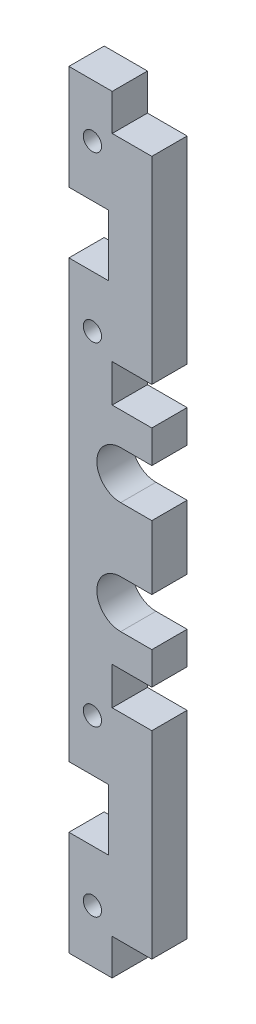
ISO-10303-21;
HEADER;
FILE_DESCRIPTION(('STEP AP214'),'2;1');
FILE_NAME('part.step','',(''),(''),'','','');
FILE_SCHEMA(('AUTOMOTIVE_DESIGN { 1 0 10303 214 1 1 1 1 }'));
ENDSEC;
DATA;
#1=APPLICATION_CONTEXT('core data for automotive mechanical design processes');
#2=APPLICATION_PROTOCOL_DEFINITION('international standard','automotive_design',2000,#1);
#3=PRODUCT_CONTEXT('',#1,'mechanical');
#4=PRODUCT('Part','Part','',(#3));
#5=PRODUCT_RELATED_PRODUCT_CATEGORY('part','',(#4));
#6=PRODUCT_DEFINITION_FORMATION('','',#4);
#7=PRODUCT_DEFINITION_CONTEXT('part definition',#1,'design');
#8=PRODUCT_DEFINITION('design','',#6,#7);
#9=PRODUCT_DEFINITION_SHAPE('','',#8);
#10=(LENGTH_UNIT() NAMED_UNIT(*) SI_UNIT(.MILLI.,.METRE.));
#11=(NAMED_UNIT(*) PLANE_ANGLE_UNIT() SI_UNIT($,.RADIAN.));
#12=(NAMED_UNIT(*) SI_UNIT($,.STERADIAN.) SOLID_ANGLE_UNIT());
#13=UNCERTAINTY_MEASURE_WITH_UNIT(LENGTH_MEASURE(1.E-05),#10,'distance_accuracy_value','');
#14=(GEOMETRIC_REPRESENTATION_CONTEXT(3) GLOBAL_UNCERTAINTY_ASSIGNED_CONTEXT((#13)) GLOBAL_UNIT_ASSIGNED_CONTEXT((#10,
#11,#12)) REPRESENTATION_CONTEXT('',''));
#15=CARTESIAN_POINT('',(0.,0.,0.));
#16=DIRECTION('',(0.,0.,1.));
#17=DIRECTION('',(1.,0.,0.));
#18=AXIS2_PLACEMENT_3D('',#15,#16,#17);
#19=CARTESIAN_POINT('',(-65.3504501830032,-66.5799999991971,-6.));
#20=DIRECTION('',(1.,0.,0.));
#21=DIRECTION('',(0.,0.,-1.));
#22=AXIS2_PLACEMENT_3D('',#19,#20,#21);
#23=PLANE('',#22);
#24=DIRECTION('',(0.,0.,-1.));
#25=VECTOR('',#24,1.);
#26=CARTESIAN_POINT('',(-65.3504501830032,10.1548441508045,4.));
#27=LINE('',#26,#25);
#28=CARTESIAN_POINT('',(-65.3504501830032,10.1548441508045,0.));
#29=VERTEX_POINT('',#28);
#30=CARTESIAN_POINT('',(-65.3504501830032,10.1548441508045,-6.));
#31=VERTEX_POINT('',#30);
#32=EDGE_CURVE('E269',#29,#31,#27,.T.);
#33=ORIENTED_EDGE('',*,*,#32,.F.);
#34=DIRECTION('',(0.,1.,0.));
#35=VECTOR('',#34,1.);
#36=CARTESIAN_POINT('',(-65.3504501830032,-66.5799999991971,0.));
#37=LINE('',#36,#35);
#38=CARTESIAN_POINT('',(-65.3504501830032,-0.745155849195489,0.));
#39=VERTEX_POINT('',#38);
#40=EDGE_CURVE('E502',#39,#29,#37,.T.);
#41=ORIENTED_EDGE('',*,*,#40,.F.);
#42=DIRECTION('',(0.,0.,-1.));
#43=VECTOR('',#42,1.);
#44=CARTESIAN_POINT('',(-65.3504501830032,-0.745155849195488,4.));
#45=LINE('',#44,#43);
#46=CARTESIAN_POINT('',(-65.3504501830032,-0.745155849195488,-6.));
#47=VERTEX_POINT('',#46);
#48=EDGE_CURVE('E58',#39,#47,#45,.T.);
#49=ORIENTED_EDGE('',*,*,#48,.T.);
#50=DIRECTION('',(0.,1.,0.));
#51=VECTOR('',#50,1.);
#52=CARTESIAN_POINT('',(-65.3504501830032,-66.5799999991971,-6.));
#53=LINE('',#52,#51);
#54=EDGE_CURVE('E521',#47,#31,#53,.T.);
#55=ORIENTED_EDGE('',*,*,#54,.T.);
#56=EDGE_LOOP('',(#33,#41,#49,#55));
#57=FACE_BOUND('',#56,.T.);
#58=ADVANCED_FACE('F35',(#57),#23,.T.);
#59=DIRECTION('',(0.,0.,-1.));
#60=VECTOR('',#59,1.);
#61=CARTESIAN_POINT('',(-65.3504501830032,-8.84515584919549,4.));
#62=LINE('',#61,#60);
#63=CARTESIAN_POINT('',(-65.3504501830032,-8.84515584919549,0.));
#64=VERTEX_POINT('',#63);
#65=CARTESIAN_POINT('',(-65.3504501830032,-8.84515584919549,-6.));
#66=VERTEX_POINT('',#65);
#67=EDGE_CURVE('E283',#64,#66,#62,.T.);
#68=ORIENTED_EDGE('',*,*,#67,.F.);
#69=CARTESIAN_POINT('',(-65.3504501830032,-14.3799999991971,0.));
#70=VERTEX_POINT('',#69);
#71=EDGE_CURVE('E460',#70,#64,#37,.T.);
#72=ORIENTED_EDGE('',*,*,#71,.F.);
#73=DIRECTION('',(0.,0.,1.));
#74=VECTOR('',#73,1.);
#75=CARTESIAN_POINT('',(-65.3504501830032,-14.3799999991971,-6.));
#76=LINE('',#75,#74);
#77=CARTESIAN_POINT('',(-65.3504501830032,-14.3799999991971,-6.));
#78=VERTEX_POINT('',#77);
#79=EDGE_CURVE('E369',#78,#70,#76,.T.);
#80=ORIENTED_EDGE('',*,*,#79,.F.);
#81=EDGE_CURVE('E448',#78,#66,#53,.T.);
#82=ORIENTED_EDGE('',*,*,#81,.T.);
#83=EDGE_LOOP('',(#68,#72,#80,#82));
#84=FACE_BOUND('',#83,.T.);
#85=ADVANCED_FACE('F545',(#84),#23,.T.);
#86=CARTESIAN_POINT('',(-79.4504501830032,-66.5799999991971,-6.));
#87=DIRECTION('',(-1.,0.,0.));
#88=DIRECTION('',(0.,0.,1.));
#89=AXIS2_PLACEMENT_3D('',#86,#87,#88);
#90=PLANE('',#89);
#91=DIRECTION('',(0.,0.,1.));
#92=VECTOR('',#91,1.);
#93=CARTESIAN_POINT('',(-79.4504501829166,41.8000000008195,-6.));
#94=LINE('',#93,#92);
#95=CARTESIAN_POINT('',(-79.4504501829166,41.8000000008195,-6.));
#96=VERTEX_POINT('',#95);
#97=CARTESIAN_POINT('',(-79.4504501829166,41.8000000008195,0.));
#98=VERTEX_POINT('',#97);
#99=EDGE_CURVE('E327',#96,#98,#94,.T.);
#100=ORIENTED_EDGE('',*,*,#99,.F.);
#101=DIRECTION('',(0.,-1.,0.));
#102=VECTOR('',#101,1.);
#103=CARTESIAN_POINT('',(-79.4504501830032,-66.5799999991971,-6.));
#104=LINE('',#103,#102);
#105=CARTESIAN_POINT('',(-79.4504501829166,-32.3903117091972,-6.));
#106=VERTEX_POINT('',#105);
#107=EDGE_CURVE('E456',#96,#106,#104,.T.);
#108=ORIENTED_EDGE('',*,*,#107,.T.);
#109=DIRECTION('',(0.,0.,1.));
#110=VECTOR('',#109,1.);
#111=CARTESIAN_POINT('',(-79.4504501829166,-32.3903117091972,-6.));
#112=LINE('',#111,#110);
#113=CARTESIAN_POINT('',(-79.4504501829166,-32.3903117091972,0.));
#114=VERTEX_POINT('',#113);
#115=EDGE_CURVE('E436',#106,#114,#112,.T.);
#116=ORIENTED_EDGE('',*,*,#115,.T.);
#117=DIRECTION('',(0.,-1.,0.));
#118=VECTOR('',#117,1.);
#119=CARTESIAN_POINT('',(-79.4504501830032,-66.5799999991971,0.));
#120=LINE('',#119,#118);
#121=EDGE_CURVE('E469',#98,#114,#120,.T.);
#122=ORIENTED_EDGE('',*,*,#121,.F.);
#123=EDGE_LOOP('',(#100,#108,#116,#122));
#124=FACE_BOUND('',#123,.T.);
#125=ADVANCED_FACE('F578',(#124),#90,.T.);
#126=DIRECTION('',(0.,0.,1.));
#127=VECTOR('',#126,1.);
#128=CARTESIAN_POINT('',(-65.3504501830032,-54.4370571475993,-6.));
#129=LINE('',#128,#127);
#130=CARTESIAN_POINT('',(-65.3504501830032,-54.4370571475993,-6.));
#131=VERTEX_POINT('',#130);
#132=CARTESIAN_POINT('',(-65.3504501830032,-54.4370571475993,0.));
#133=VERTEX_POINT('',#132);
#134=EDGE_CURVE('E347',#131,#133,#129,.T.);
#135=ORIENTED_EDGE('',*,*,#134,.F.);
#136=CARTESIAN_POINT('',(-65.3504501830032,-20.7799999991972,-6.));
#137=VERTEX_POINT('',#136);
#138=EDGE_CURVE('E445',#131,#137,#53,.T.);
#139=ORIENTED_EDGE('',*,*,#138,.T.);
#140=DIRECTION('',(0.,0.,-1.));
#141=VECTOR('',#140,1.);
#142=CARTESIAN_POINT('',(-65.3504501830032,-20.7799999991971,-6.));
#143=LINE('',#142,#141);
#144=CARTESIAN_POINT('',(-65.3504501830032,-20.7799999991972,0.));
#145=VERTEX_POINT('',#144);
#146=EDGE_CURVE('E373',#145,#137,#143,.T.);
#147=ORIENTED_EDGE('',*,*,#146,.F.);
#148=EDGE_CURVE('E457',#133,#145,#37,.T.);
#149=ORIENTED_EDGE('',*,*,#148,.F.);
#150=EDGE_LOOP('',(#135,#139,#147,#149));
#151=FACE_BOUND('',#150,.T.);
#152=ADVANCED_FACE('F557',(#151),#23,.T.);
#153=DIRECTION('',(0.,0.,-1.));
#154=VECTOR('',#153,1.);
#155=CARTESIAN_POINT('',(-65.3504501830032,18.2548441508045,4.));
#156=LINE('',#155,#154);
#157=CARTESIAN_POINT('',(-65.3504501830032,18.2548441508045,0.));
#158=VERTEX_POINT('',#157);
#159=CARTESIAN_POINT('',(-65.3504501830032,18.2548441508045,-6.));
#160=VERTEX_POINT('',#159);
#161=EDGE_CURVE('E50',#158,#160,#156,.T.);
#162=ORIENTED_EDGE('',*,*,#161,.T.);
#163=CARTESIAN_POINT('',(-65.3504501830032,23.8000000008046,-6.));
#164=VERTEX_POINT('',#163);
#165=EDGE_CURVE('E263',#160,#164,#53,.T.);
#166=ORIENTED_EDGE('',*,*,#165,.T.);
#167=DIRECTION('',(0.,0.,-1.));
#168=VECTOR('',#167,1.);
#169=CARTESIAN_POINT('',(-65.3504501830032,23.8000000008046,-6.));
#170=LINE('',#169,#168);
#171=CARTESIAN_POINT('',(-65.3504501830032,23.8000000008046,0.));
#172=VERTEX_POINT('',#171);
#173=EDGE_CURVE('E397',#172,#164,#170,.T.);
#174=ORIENTED_EDGE('',*,*,#173,.F.);
#175=EDGE_CURVE('E461',#158,#172,#37,.T.);
#176=ORIENTED_EDGE('',*,*,#175,.F.);
#177=EDGE_LOOP('',(#162,#166,#174,#176));
#178=FACE_BOUND('',#177,.T.);
#179=ADVANCED_FACE('F606',(#178),#23,.T.);
#180=DIRECTION('',(0.,0.,1.));
#181=VECTOR('',#180,1.);
#182=CARTESIAN_POINT('',(-79.4504501829166,52.2000000008195,-6.));
#183=LINE('',#182,#181);
#184=CARTESIAN_POINT('',(-79.4504501829166,52.2000000008195,-6.));
#185=VERTEX_POINT('',#184);
#186=CARTESIAN_POINT('',(-79.4504501829166,52.2000000008195,0.));
#187=VERTEX_POINT('',#186);
#188=EDGE_CURVE('E330',#185,#187,#183,.T.);
#189=ORIENTED_EDGE('',*,*,#188,.T.);
#190=CARTESIAN_POINT('',(-79.4504501830032,70.0000000008047,0.));
#191=VERTEX_POINT('',#190);
#192=EDGE_CURVE('E465',#191,#187,#120,.T.);
#193=ORIENTED_EDGE('',*,*,#192,.F.);
#194=DIRECTION('',(0.,0.,1.));
#195=VECTOR('',#194,1.);
#196=CARTESIAN_POINT('',(-79.4504501830032,70.0000000008047,-6.));
#197=LINE('',#196,#195);
#198=CARTESIAN_POINT('',(-79.4504501830032,70.0000000008047,-6.));
#199=VERTEX_POINT('',#198);
#200=EDGE_CURVE('E455',#199,#191,#197,.T.);
#201=ORIENTED_EDGE('',*,*,#200,.F.);
#202=EDGE_CURVE('E452',#199,#185,#104,.T.);
#203=ORIENTED_EDGE('',*,*,#202,.T.);
#204=EDGE_LOOP('',(#189,#193,#201,#203));
#205=FACE_BOUND('',#204,.T.);
#206=ADVANCED_FACE('F596',(#205),#90,.T.);
#207=CARTESIAN_POINT('',(-79.4504501830032,-60.5799999991971,-6.));
#208=DIRECTION('',(0.,-1.,0.));
#209=DIRECTION('',(0.,0.,-1.));
#210=AXIS2_PLACEMENT_3D('',#207,#208,#209);
#211=PLANE('',#210);
#212=DIRECTION('',(0.,0.,-1.));
#213=VECTOR('',#212,1.);
#214=CARTESIAN_POINT('',(-72.1004501830032,-60.5799999991971,-6.));
#215=LINE('',#214,#213);
#216=CARTESIAN_POINT('',(-72.1004501830032,-60.5799999991971,0.));
#217=VERTEX_POINT('',#216);
#218=CARTESIAN_POINT('',(-72.1004501830032,-60.5799999991971,-6.));
#219=VERTEX_POINT('',#218);
#220=EDGE_CURVE('E349',#217,#219,#215,.T.);
#221=ORIENTED_EDGE('',*,*,#220,.F.);
#222=DIRECTION('',(1.,0.,0.));
#223=VECTOR('',#222,1.);
#224=CARTESIAN_POINT('',(0.,-60.5799999991971,0.));
#225=LINE('',#224,#223);
#226=CARTESIAN_POINT('',(-79.4504501830032,-60.5799999991971,0.));
#227=VERTEX_POINT('',#226);
#228=EDGE_CURVE('E439',#227,#217,#225,.T.);
#229=ORIENTED_EDGE('',*,*,#228,.F.);
#230=DIRECTION('',(0.,0.,1.));
#231=VECTOR('',#230,1.);
#232=CARTESIAN_POINT('',(-79.4504501830032,-60.5799999991971,-6.));
#233=LINE('',#232,#231);
#234=CARTESIAN_POINT('',(-79.4504501830032,-60.5799999991971,-6.));
#235=VERTEX_POINT('',#234);
#236=EDGE_CURVE('E472',#235,#227,#233,.T.);
#237=ORIENTED_EDGE('',*,*,#236,.F.);
#238=DIRECTION('',(1.,0.,0.));
#239=VECTOR('',#238,1.);
#240=CARTESIAN_POINT('',(0.,-60.5799999991971,-6.));
#241=LINE('',#240,#239);
#242=EDGE_CURVE('E468',#235,#219,#241,.T.);
#243=ORIENTED_EDGE('',*,*,#242,.T.);
#244=EDGE_LOOP('',(#221,#229,#237,#243));
#245=FACE_BOUND('',#244,.T.);
#246=ADVANCED_FACE('F37',(#245),#211,.T.);
#247=DIRECTION('',(0.,0.,1.));
#248=VECTOR('',#247,1.);
#249=CARTESIAN_POINT('',(-79.4504501829166,-42.7903117091971,-6.));
#250=LINE('',#249,#248);
#251=CARTESIAN_POINT('',(-79.4504501829166,-42.7903117091971,-6.));
#252=VERTEX_POINT('',#251);
#253=CARTESIAN_POINT('',(-79.4504501830032,-42.7903117091971,0.));
#254=VERTEX_POINT('',#253);
#255=EDGE_CURVE('E428',#252,#254,#250,.T.);
#256=ORIENTED_EDGE('',*,*,#255,.F.);
#257=EDGE_CURVE('E451',#252,#235,#104,.T.);
#258=ORIENTED_EDGE('',*,*,#257,.T.);
#259=ORIENTED_EDGE('',*,*,#236,.T.);
#260=EDGE_CURVE('E464',#254,#227,#120,.T.);
#261=ORIENTED_EDGE('',*,*,#260,.F.);
#262=EDGE_LOOP('',(#256,#258,#259,#261));
#263=FACE_BOUND('',#262,.T.);
#264=ADVANCED_FACE('F592',(#263),#90,.T.);
#265=CARTESIAN_POINT('',(-79.4504501830032,70.0000000008047,-6.));
#266=DIRECTION('',(0.,1.,0.));
#267=DIRECTION('',(0.,0.,1.));
#268=AXIS2_PLACEMENT_3D('',#265,#266,#267);
#269=PLANE('',#268);
#270=DIRECTION('',(0.,0.,1.));
#271=VECTOR('',#270,1.);
#272=CARTESIAN_POINT('',(-72.088894602048,70.0000000008047,-6.));
#273=LINE('',#272,#271);
#274=CARTESIAN_POINT('',(-72.088894602048,70.0000000008047,-6.));
#275=VERTEX_POINT('',#274);
#276=CARTESIAN_POINT('',(-72.088894602048,70.0000000008047,0.));
#277=VERTEX_POINT('',#276);
#278=EDGE_CURVE('E412',#275,#277,#273,.T.);
#279=ORIENTED_EDGE('',*,*,#278,.F.);
#280=DIRECTION('',(-1.,0.,0.));
#281=VECTOR('',#280,1.);
#282=CARTESIAN_POINT('',(-79.4504501830032,70.0000000008047,-6.));
#283=LINE('',#282,#281);
#284=EDGE_CURVE('E447',#275,#199,#283,.T.);
#285=ORIENTED_EDGE('',*,*,#284,.T.);
#286=ORIENTED_EDGE('',*,*,#200,.T.);
#287=DIRECTION('',(-1.,0.,0.));
#288=VECTOR('',#287,1.);
#289=CARTESIAN_POINT('',(-79.4504501830032,70.0000000008047,0.));
#290=LINE('',#289,#288);
#291=EDGE_CURVE('E459',#277,#191,#290,.T.);
#292=ORIENTED_EDGE('',*,*,#291,.F.);
#293=EDGE_LOOP('',(#279,#285,#286,#292));
#294=FACE_BOUND('',#293,.T.);
#295=ADVANCED_FACE('F594',(#294),#269,.T.);
#296=DIRECTION('',(0.,0.,1.));
#297=VECTOR('',#296,1.);
#298=CARTESIAN_POINT('',(-65.3504501830032,30.2000000008046,-6.));
#299=LINE('',#298,#297);
#300=CARTESIAN_POINT('',(-65.3504501830032,30.2000000008046,-6.));
#301=VERTEX_POINT('',#300);
#302=CARTESIAN_POINT('',(-65.3504501830032,30.2000000008046,0.));
#303=VERTEX_POINT('',#302);
#304=EDGE_CURVE('E393',#301,#303,#299,.T.);
#305=ORIENTED_EDGE('',*,*,#304,.F.);
#306=CARTESIAN_POINT('',(-65.3504501830032,63.8000000008047,-6.));
#307=VERTEX_POINT('',#306);
#308=EDGE_CURVE('E449',#301,#307,#53,.T.);
#309=ORIENTED_EDGE('',*,*,#308,.T.);
#310=DIRECTION('',(0.,0.,-1.));
#311=VECTOR('',#310,1.);
#312=CARTESIAN_POINT('',(-65.3504501830032,63.8000000008047,-6.));
#313=LINE('',#312,#311);
#314=CARTESIAN_POINT('',(-65.3504501830032,63.8000000008047,0.));
#315=VERTEX_POINT('',#314);
#316=EDGE_CURVE('E414',#315,#307,#313,.T.);
#317=ORIENTED_EDGE('',*,*,#316,.F.);
#318=EDGE_CURVE('E462',#303,#315,#37,.T.);
#319=ORIENTED_EDGE('',*,*,#318,.F.);
#320=EDGE_LOOP('',(#305,#309,#317,#319));
#321=FACE_BOUND('',#320,.T.);
#322=ADVANCED_FACE('F519',(#321),#23,.T.);
#323=CARTESIAN_POINT('',(0.,0.,-6.));
#324=DIRECTION('',(0.,0.,1.));
#325=DIRECTION('',(1.,0.,0.));
#326=AXIS2_PLACEMENT_3D('',#323,#324,#325);
#327=PLANE('',#326);
#328=CARTESIAN_POINT('',(-75.4504501830032,-23.5799999991971,-6.));
#329=DIRECTION('',(0.,0.,1.));
#330=DIRECTION('',(1.,0.,0.));
#331=AXIS2_PLACEMENT_3D('',#328,#329,#330);
#332=CIRCLE('',#331,1.54999999999999);
#333=CARTESIAN_POINT('',(-73.9004501830032,-23.5799999991971,-6.));
#334=VERTEX_POINT('',#333);
#335=EDGE_CURVE('E287',#334,#334,#332,.T.);
#336=ORIENTED_EDGE('',*,*,#335,.T.);
#337=EDGE_LOOP('',(#336));
#338=FACE_BOUND('',#337,.T.);
#339=CARTESIAN_POINT('',(-75.4504501830032,33.0000000008047,-6.));
#340=DIRECTION('',(0.,0.,1.));
#341=DIRECTION('',(1.,0.,0.));
#342=AXIS2_PLACEMENT_3D('',#339,#340,#341);
#343=CIRCLE('',#342,1.54999999999999);
#344=CARTESIAN_POINT('',(-73.9004501830032,33.0000000008047,-6.));
#345=VERTEX_POINT('',#344);
#346=EDGE_CURVE('E293',#345,#345,#343,.T.);
#347=ORIENTED_EDGE('',*,*,#346,.T.);
#348=EDGE_LOOP('',(#347));
#349=FACE_BOUND('',#348,.T.);
#350=CARTESIAN_POINT('',(-75.4504501830032,-51.5799999991971,-6.));
#351=DIRECTION('',(0.,0.,1.));
#352=DIRECTION('',(1.,0.,0.));
#353=AXIS2_PLACEMENT_3D('',#350,#351,#352);
#354=CIRCLE('',#353,1.54999999999999);
#355=CARTESIAN_POINT('',(-73.9004501830032,-51.5799999991971,-6.));
#356=VERTEX_POINT('',#355);
#357=EDGE_CURVE('E299',#356,#356,#354,.T.);
#358=ORIENTED_EDGE('',*,*,#357,.T.);
#359=EDGE_LOOP('',(#358));
#360=FACE_BOUND('',#359,.T.);
#361=CARTESIAN_POINT('',(-75.4504501830032,61.0000000008047,-6.));
#362=DIRECTION('',(0.,0.,1.));
#363=DIRECTION('',(1.,0.,0.));
#364=AXIS2_PLACEMENT_3D('',#361,#362,#363);
#365=CIRCLE('',#364,1.54999999999999);
#366=CARTESIAN_POINT('',(-73.9004501830032,61.0000000008047,-6.));
#367=VERTEX_POINT('',#366);
#368=EDGE_CURVE('E305',#367,#367,#365,.T.);
#369=ORIENTED_EDGE('',*,*,#368,.T.);
#370=EDGE_LOOP('',(#369));
#371=FACE_BOUND('',#370,.T.);
#372=CARTESIAN_POINT('',(-70.6504501829326,14.2048441508045,-6.));
#373=DIRECTION('',(0.,0.,-1.));
#374=DIRECTION('',(-1.,0.,0.));
#375=AXIS2_PLACEMENT_3D('',#372,#373,#374);
#376=CIRCLE('',#375,4.05);
#377=CARTESIAN_POINT('',(-70.6504501829326,10.1548441508045,-6.));
#378=VERTEX_POINT('',#377);
#379=CARTESIAN_POINT('',(-70.6504501829326,18.2548441508045,-6.));
#380=VERTEX_POINT('',#379);
#381=EDGE_CURVE('E252',#378,#380,#376,.T.);
#382=ORIENTED_EDGE('',*,*,#381,.F.);
#383=DIRECTION('',(-1.,0.,0.));
#384=VECTOR('',#383,1.);
#385=CARTESIAN_POINT('',(-65.3504501830032,10.1548441508045,-6.));
#386=LINE('',#385,#384);
#387=EDGE_CURVE('E249',#31,#378,#386,.T.);
#388=ORIENTED_EDGE('',*,*,#387,.F.);
#389=ORIENTED_EDGE('',*,*,#54,.F.);
#390=DIRECTION('',(1.,0.,0.));
#391=VECTOR('',#390,1.);
#392=CARTESIAN_POINT('',(-70.6504501829326,-0.745155849195491,-6.));
#393=LINE('',#392,#391);
#394=CARTESIAN_POINT('',(-70.6504501829326,-0.745155849195491,-6.));
#395=VERTEX_POINT('',#394);
#396=EDGE_CURVE('E274',#395,#47,#393,.T.);
#397=ORIENTED_EDGE('',*,*,#396,.F.);
#398=CARTESIAN_POINT('',(-70.6504501829326,-4.79515584919549,-6.));
#399=DIRECTION('',(0.,0.,-1.));
#400=DIRECTION('',(-1.,0.,0.));
#401=AXIS2_PLACEMENT_3D('',#398,#399,#400);
#402=CIRCLE('',#401,4.05);
#403=CARTESIAN_POINT('',(-70.6504501829326,-8.84515584919548,-6.));
#404=VERTEX_POINT('',#403);
#405=EDGE_CURVE('E268',#404,#395,#402,.T.);
#406=ORIENTED_EDGE('',*,*,#405,.F.);
#407=DIRECTION('',(-1.,0.,0.));
#408=VECTOR('',#407,1.);
#409=CARTESIAN_POINT('',(-65.3504501830032,-8.84515584919549,-6.));
#410=LINE('',#409,#408);
#411=EDGE_CURVE('E276',#66,#404,#410,.T.);
#412=ORIENTED_EDGE('',*,*,#411,.F.);
#413=ORIENTED_EDGE('',*,*,#81,.F.);
#414=DIRECTION('',(-1.,0.,0.));
#415=VECTOR('',#414,1.);
#416=CARTESIAN_POINT('',(-65.1388946021054,-14.3799999991971,-6.));
#417=LINE('',#416,#415);
#418=CARTESIAN_POINT('',(-72.0888946021054,-14.3799999991971,-6.));
#419=VERTEX_POINT('',#418);
#420=EDGE_CURVE('E352',#78,#419,#417,.T.);
#421=ORIENTED_EDGE('',*,*,#420,.T.);
#422=DIRECTION('',(0.,-1.,0.));
#423=VECTOR('',#422,1.);
#424=CARTESIAN_POINT('',(-72.0888946021054,-14.3799999991971,-6.));
#425=LINE('',#424,#423);
#426=CARTESIAN_POINT('',(-72.0888946021054,-20.7799999991972,-6.));
#427=VERTEX_POINT('',#426);
#428=EDGE_CURVE('E355',#419,#427,#425,.T.);
#429=ORIENTED_EDGE('',*,*,#428,.T.);
#430=DIRECTION('',(1.,0.,0.));
#431=VECTOR('',#430,1.);
#432=CARTESIAN_POINT('',(-72.0888946021054,-20.7799999991972,-6.));
#433=LINE('',#432,#431);
#434=EDGE_CURVE('E359',#427,#137,#433,.T.);
#435=ORIENTED_EDGE('',*,*,#434,.T.);
#436=ORIENTED_EDGE('',*,*,#138,.F.);
#437=DIRECTION('',(-1.,0.,0.));
#438=VECTOR('',#437,1.);
#439=CARTESIAN_POINT('',(-72.1004501830032,-54.4370571475993,-6.));
#440=LINE('',#439,#438);
#441=CARTESIAN_POINT('',(-72.1004501830032,-54.4370571475993,-6.));
#442=VERTEX_POINT('',#441);
#443=EDGE_CURVE('E337',#131,#442,#440,.T.);
#444=ORIENTED_EDGE('',*,*,#443,.T.);
#445=DIRECTION('',(0.,-1.,0.));
#446=VECTOR('',#445,1.);
#447=CARTESIAN_POINT('',(-72.1004501830032,-60.7799999991971,-6.));
#448=LINE('',#447,#446);
#449=EDGE_CURVE('E340',#442,#219,#448,.T.);
#450=ORIENTED_EDGE('',*,*,#449,.T.);
#451=ORIENTED_EDGE('',*,*,#242,.F.);
#452=ORIENTED_EDGE('',*,*,#257,.F.);
#453=DIRECTION('',(1.,0.,0.));
#454=VECTOR('',#453,1.);
#455=CARTESIAN_POINT('',(-72.7004501830032,-42.7903117091971,-6.));
#456=LINE('',#455,#454);
#457=CARTESIAN_POINT('',(-72.7004501830032,-42.7903117091971,-6.));
#458=VERTEX_POINT('',#457);
#459=EDGE_CURVE('E418',#252,#458,#456,.T.);
#460=ORIENTED_EDGE('',*,*,#459,.T.);
#461=DIRECTION('',(0.,1.,0.));
#462=VECTOR('',#461,1.);
#463=CARTESIAN_POINT('',(-72.7004501830032,-32.3903117091972,-6.));
#464=LINE('',#463,#462);
#465=CARTESIAN_POINT('',(-72.7004501830032,-32.3903117091972,-6.));
#466=VERTEX_POINT('',#465);
#467=EDGE_CURVE('E421',#458,#466,#464,.T.);
#468=ORIENTED_EDGE('',*,*,#467,.T.);
#469=DIRECTION('',(-1.,0.,0.));
#470=VECTOR('',#469,1.);
#471=CARTESIAN_POINT('',(-79.4504501829166,-32.3903117091972,-6.));
#472=LINE('',#471,#470);
#473=EDGE_CURVE('E425',#466,#106,#472,.T.);
#474=ORIENTED_EDGE('',*,*,#473,.T.);
#475=ORIENTED_EDGE('',*,*,#107,.F.);
#476=DIRECTION('',(1.,0.,0.));
#477=VECTOR('',#476,1.);
#478=CARTESIAN_POINT('',(-72.7004501830032,41.8000000008195,-6.));
#479=LINE('',#478,#477);
#480=CARTESIAN_POINT('',(-72.7004501830032,41.8000000008195,-6.));
#481=VERTEX_POINT('',#480);
#482=EDGE_CURVE('E311',#96,#481,#479,.T.);
#483=ORIENTED_EDGE('',*,*,#482,.T.);
#484=DIRECTION('',(0.,1.,0.));
#485=VECTOR('',#484,1.);
#486=CARTESIAN_POINT('',(-72.7004501830032,52.2000000008195,-6.));
#487=LINE('',#486,#485);
#488=CARTESIAN_POINT('',(-72.7004501830032,52.2000000008195,-6.));
#489=VERTEX_POINT('',#488);
#490=EDGE_CURVE('E314',#481,#489,#487,.T.);
#491=ORIENTED_EDGE('',*,*,#490,.T.);
#492=DIRECTION('',(-1.,0.,0.));
#493=VECTOR('',#492,1.);
#494=CARTESIAN_POINT('',(-79.4504501829166,52.2000000008195,-6.));
#495=LINE('',#494,#493);
#496=EDGE_CURVE('E318',#489,#185,#495,.T.);
#497=ORIENTED_EDGE('',*,*,#496,.T.);
#498=ORIENTED_EDGE('',*,*,#202,.F.);
#499=ORIENTED_EDGE('',*,*,#284,.F.);
#500=DIRECTION('',(0.,-1.,0.));
#501=VECTOR('',#500,1.);
#502=CARTESIAN_POINT('',(-72.088894602048,70.2000000008047,-6.));
#503=LINE('',#502,#501);
#504=CARTESIAN_POINT('',(-72.088894602048,63.8000000008047,-6.));
#505=VERTEX_POINT('',#504);
#506=EDGE_CURVE('E401',#275,#505,#503,.T.);
#507=ORIENTED_EDGE('',*,*,#506,.T.);
#508=DIRECTION('',(1.,0.,0.));
#509=VECTOR('',#508,1.);
#510=CARTESIAN_POINT('',(-72.088894602048,63.8000000008047,-6.));
#511=LINE('',#510,#509);
#512=EDGE_CURVE('E404',#505,#307,#511,.T.);
#513=ORIENTED_EDGE('',*,*,#512,.T.);
#514=ORIENTED_EDGE('',*,*,#308,.F.);
#515=DIRECTION('',(-1.,0.,0.));
#516=VECTOR('',#515,1.);
#517=CARTESIAN_POINT('',(-65.138894602048,30.2000000008046,-6.));
#518=LINE('',#517,#516);
#519=CARTESIAN_POINT('',(-72.0888946021054,30.2000000008046,-6.));
#520=VERTEX_POINT('',#519);
#521=EDGE_CURVE('E377',#301,#520,#518,.T.);
#522=ORIENTED_EDGE('',*,*,#521,.T.);
#523=DIRECTION('',(0.,-1.,0.));
#524=VECTOR('',#523,1.);
#525=CARTESIAN_POINT('',(-72.0888946021054,30.2000000008046,-6.));
#526=LINE('',#525,#524);
#527=CARTESIAN_POINT('',(-72.0888946021054,23.8000000008046,-6.));
#528=VERTEX_POINT('',#527);
#529=EDGE_CURVE('E380',#520,#528,#526,.T.);
#530=ORIENTED_EDGE('',*,*,#529,.T.);
#531=DIRECTION('',(1.,0.,0.));
#532=VECTOR('',#531,1.);
#533=CARTESIAN_POINT('',(-72.0888946021054,23.8000000008046,-6.));
#534=LINE('',#533,#532);
#535=EDGE_CURVE('E384',#528,#164,#534,.T.);
#536=ORIENTED_EDGE('',*,*,#535,.T.);
#537=ORIENTED_EDGE('',*,*,#165,.F.);
#538=DIRECTION('',(1.,0.,0.));
#539=VECTOR('',#538,1.);
#540=CARTESIAN_POINT('',(-70.6504501829326,18.2548441508045,-6.));
#541=LINE('',#540,#539);
#542=EDGE_CURVE('E245',#380,#160,#541,.T.);
#543=ORIENTED_EDGE('',*,*,#542,.F.);
#544=EDGE_LOOP('',(#382,#388,#389,#397,#406,#412,#413,#421,#429,#435,#436,#444,#450,#451,#452,
#460,#468,#474,#475,#483,#491,#497,#498,#499,#507,#513,#514,#522,#530,#536,#537,#543));
#545=FACE_BOUND('',#544,.T.);
#546=ADVANCED_FACE('F261',(#338,#349,#360,#371,#545),#327,.F.);
#547=CARTESIAN_POINT('',(0.,0.,0.));
#548=DIRECTION('',(0.,0.,1.));
#549=DIRECTION('',(1.,0.,0.));
#550=AXIS2_PLACEMENT_3D('',#547,#548,#549);
#551=PLANE('',#550);
#552=DIRECTION('',(1.,0.,0.));
#553=VECTOR('',#552,1.);
#554=CARTESIAN_POINT('',(0.,10.1548441508045,0.));
#555=LINE('',#554,#553);
#556=CARTESIAN_POINT('',(-70.6504501829326,10.1548441508045,0.));
#557=VERTEX_POINT('',#556);
#558=EDGE_CURVE('E12',#557,#29,#555,.T.);
#559=ORIENTED_EDGE('',*,*,#558,.F.);
#560=CARTESIAN_POINT('',(-70.6504501829326,14.2048441508045,0.));
#561=DIRECTION('',(0.,0.,1.));
#562=DIRECTION('',(1.,0.,0.));
#563=AXIS2_PLACEMENT_3D('',#560,#561,#562);
#564=CIRCLE('',#563,4.05);
#565=CARTESIAN_POINT('',(-70.6504501829326,18.2548441508045,0.));
#566=VERTEX_POINT('',#565);
#567=EDGE_CURVE('E43',#566,#557,#564,.T.);
#568=ORIENTED_EDGE('',*,*,#567,.F.);
#569=DIRECTION('',(-1.,0.,0.));
#570=VECTOR('',#569,1.);
#571=CARTESIAN_POINT('',(0.,18.2548441508044,0.));
#572=LINE('',#571,#570);
#573=EDGE_CURVE('E246',#158,#566,#572,.T.);
#574=ORIENTED_EDGE('',*,*,#573,.F.);
#575=ORIENTED_EDGE('',*,*,#175,.T.);
#576=DIRECTION('',(1.,0.,0.));
#577=VECTOR('',#576,1.);
#578=CARTESIAN_POINT('',(-72.0888946021054,23.8000000008046,0.));
#579=LINE('',#578,#577);
#580=CARTESIAN_POINT('',(-72.0888946021054,23.8000000008046,0.));
#581=VERTEX_POINT('',#580);
#582=EDGE_CURVE('E381',#581,#172,#579,.T.);
#583=ORIENTED_EDGE('',*,*,#582,.F.);
#584=DIRECTION('',(0.,-1.,0.));
#585=VECTOR('',#584,1.);
#586=CARTESIAN_POINT('',(-72.0888946021054,30.2000000008046,0.));
#587=LINE('',#586,#585);
#588=CARTESIAN_POINT('',(-72.0888946021054,30.2000000008046,0.));
#589=VERTEX_POINT('',#588);
#590=EDGE_CURVE('E376',#589,#581,#587,.T.);
#591=ORIENTED_EDGE('',*,*,#590,.F.);
#592=DIRECTION('',(-1.,0.,0.));
#593=VECTOR('',#592,1.);
#594=CARTESIAN_POINT('',(0.,30.2000000008046,0.));
#595=LINE('',#594,#593);
#596=EDGE_CURVE('E481',#303,#589,#595,.T.);
#597=ORIENTED_EDGE('',*,*,#596,.F.);
#598=ORIENTED_EDGE('',*,*,#318,.T.);
#599=DIRECTION('',(1.,0.,0.));
#600=VECTOR('',#599,1.);
#601=CARTESIAN_POINT('',(-72.088894602048,63.8000000008047,0.));
#602=LINE('',#601,#600);
#603=CARTESIAN_POINT('',(-72.088894602048,63.8000000008047,0.));
#604=VERTEX_POINT('',#603);
#605=EDGE_CURVE('E400',#604,#315,#602,.T.);
#606=ORIENTED_EDGE('',*,*,#605,.F.);
#607=DIRECTION('',(0.,-1.,0.));
#608=VECTOR('',#607,1.);
#609=CARTESIAN_POINT('',(-72.088894602048,0.,0.));
#610=LINE('',#609,#608);
#611=EDGE_CURVE('E479',#277,#604,#610,.T.);
#612=ORIENTED_EDGE('',*,*,#611,.F.);
#613=ORIENTED_EDGE('',*,*,#291,.T.);
#614=ORIENTED_EDGE('',*,*,#192,.T.);
#615=DIRECTION('',(-1.,0.,0.));
#616=VECTOR('',#615,1.);
#617=CARTESIAN_POINT('',(-79.4504501829166,52.2000000008195,0.));
#618=LINE('',#617,#616);
#619=CARTESIAN_POINT('',(-72.7004501830032,52.2000000008195,0.));
#620=VERTEX_POINT('',#619);
#621=EDGE_CURVE('E315',#620,#187,#618,.T.);
#622=ORIENTED_EDGE('',*,*,#621,.F.);
#623=DIRECTION('',(0.,1.,0.));
#624=VECTOR('',#623,1.);
#625=CARTESIAN_POINT('',(-72.7004501830032,52.2000000008195,0.));
#626=LINE('',#625,#624);
#627=CARTESIAN_POINT('',(-72.7004501830032,41.8000000008195,0.));
#628=VERTEX_POINT('',#627);
#629=EDGE_CURVE('E323',#628,#620,#626,.T.);
#630=ORIENTED_EDGE('',*,*,#629,.F.);
#631=DIRECTION('',(1.,0.,0.));
#632=VECTOR('',#631,1.);
#633=CARTESIAN_POINT('',(-72.7004501830032,41.8000000008195,0.));
#634=LINE('',#633,#632);
#635=EDGE_CURVE('E308',#98,#628,#634,.T.);
#636=ORIENTED_EDGE('',*,*,#635,.F.);
#637=ORIENTED_EDGE('',*,*,#121,.T.);
#638=DIRECTION('',(-1.,0.,0.));
#639=VECTOR('',#638,1.);
#640=CARTESIAN_POINT('',(-79.4504501829166,-32.3903117091972,0.));
#641=LINE('',#640,#639);
#642=CARTESIAN_POINT('',(-72.7004501830032,-32.3903117091972,0.));
#643=VERTEX_POINT('',#642);
#644=EDGE_CURVE('E422',#643,#114,#641,.T.);
#645=ORIENTED_EDGE('',*,*,#644,.F.);
#646=DIRECTION('',(0.,1.,0.));
#647=VECTOR('',#646,1.);
#648=CARTESIAN_POINT('',(-72.7004501830032,-32.3903117091972,0.));
#649=LINE('',#648,#647);
#650=CARTESIAN_POINT('',(-72.7004501830032,-42.7903117091971,0.));
#651=VERTEX_POINT('',#650);
#652=EDGE_CURVE('E431',#651,#643,#649,.T.);
#653=ORIENTED_EDGE('',*,*,#652,.F.);
#654=DIRECTION('',(1.,0.,0.));
#655=VECTOR('',#654,1.);
#656=CARTESIAN_POINT('',(-72.7004501830032,-42.7903117091971,0.));
#657=LINE('',#656,#655);
#658=EDGE_CURVE('E417',#254,#651,#657,.T.);
#659=ORIENTED_EDGE('',*,*,#658,.F.);
#660=ORIENTED_EDGE('',*,*,#260,.T.);
#661=ORIENTED_EDGE('',*,*,#228,.T.);
#662=DIRECTION('',(0.,-1.,0.));
#663=VECTOR('',#662,1.);
#664=CARTESIAN_POINT('',(-72.1004501830032,-60.7799999991971,0.));
#665=LINE('',#664,#663);
#666=CARTESIAN_POINT('',(-72.1004501830032,-54.4370571475993,0.));
#667=VERTEX_POINT('',#666);
#668=EDGE_CURVE('E329',#667,#217,#665,.T.);
#669=ORIENTED_EDGE('',*,*,#668,.F.);
#670=DIRECTION('',(-1.,0.,0.));
#671=VECTOR('',#670,1.);
#672=CARTESIAN_POINT('',(0.,-54.4370571475993,0.));
#673=LINE('',#672,#671);
#674=EDGE_CURVE('E485',#133,#667,#673,.T.);
#675=ORIENTED_EDGE('',*,*,#674,.F.);
#676=ORIENTED_EDGE('',*,*,#148,.T.);
#677=DIRECTION('',(1.,0.,0.));
#678=VECTOR('',#677,1.);
#679=CARTESIAN_POINT('',(-72.0888946021054,-20.7799999991972,0.));
#680=LINE('',#679,#678);
#681=CARTESIAN_POINT('',(-72.0888946021054,-20.7799999991972,0.));
#682=VERTEX_POINT('',#681);
#683=EDGE_CURVE('E356',#682,#145,#680,.T.);
#684=ORIENTED_EDGE('',*,*,#683,.F.);
#685=DIRECTION('',(0.,-1.,0.));
#686=VECTOR('',#685,1.);
#687=CARTESIAN_POINT('',(-72.0888946021054,-14.3799999991971,0.));
#688=LINE('',#687,#686);
#689=CARTESIAN_POINT('',(-72.0888946021054,-14.3799999991971,0.));
#690=VERTEX_POINT('',#689);
#691=EDGE_CURVE('E351',#690,#682,#688,.T.);
#692=ORIENTED_EDGE('',*,*,#691,.F.);
#693=DIRECTION('',(-1.,0.,0.));
#694=VECTOR('',#693,1.);
#695=CARTESIAN_POINT('',(0.,-14.3799999991971,0.));
#696=LINE('',#695,#694);
#697=EDGE_CURVE('E483',#70,#690,#696,.T.);
#698=ORIENTED_EDGE('',*,*,#697,.F.);
#699=ORIENTED_EDGE('',*,*,#71,.T.);
#700=DIRECTION('',(1.,0.,0.));
#701=VECTOR('',#700,1.);
#702=CARTESIAN_POINT('',(0.,-8.84515584919551,0.));
#703=LINE('',#702,#701);
#704=CARTESIAN_POINT('',(-70.6504501829326,-8.84515584919548,0.));
#705=VERTEX_POINT('',#704);
#706=EDGE_CURVE('E491',#705,#64,#703,.T.);
#707=ORIENTED_EDGE('',*,*,#706,.F.);
#708=CARTESIAN_POINT('',(-70.6504501829326,-4.79515584919549,0.));
#709=DIRECTION('',(0.,0.,1.));
#710=DIRECTION('',(1.,0.,0.));
#711=AXIS2_PLACEMENT_3D('',#708,#709,#710);
#712=CIRCLE('',#711,4.05);
#713=CARTESIAN_POINT('',(-70.6504501829326,-0.745155849195491,0.));
#714=VERTEX_POINT('',#713);
#715=EDGE_CURVE('E489',#714,#705,#712,.T.);
#716=ORIENTED_EDGE('',*,*,#715,.F.);
#717=DIRECTION('',(-1.,0.,0.));
#718=VECTOR('',#717,1.);
#719=CARTESIAN_POINT('',(0.,-0.745155849195458,0.));
#720=LINE('',#719,#718);
#721=EDGE_CURVE('E487',#39,#714,#720,.T.);
#722=ORIENTED_EDGE('',*,*,#721,.F.);
#723=ORIENTED_EDGE('',*,*,#40,.T.);
#724=EDGE_LOOP('',(#559,#568,#574,#575,#583,#591,#597,#598,#606,#612,#613,#614,#622,#630,#636,
#637,#645,#653,#659,#660,#661,#669,#675,#676,#684,#692,#698,#699,#707,#716,#722,#723));
#725=FACE_BOUND('',#724,.T.);
#726=CARTESIAN_POINT('',(-75.4504501830032,-23.5799999991971,0.));
#727=DIRECTION('',(0.,0.,1.));
#728=DIRECTION('',(1.,0.,0.));
#729=AXIS2_PLACEMENT_3D('',#726,#727,#728);
#730=CIRCLE('',#729,1.54999999999999);
#731=CARTESIAN_POINT('',(-73.9004501830032,-23.5799999991971,0.));
#732=VERTEX_POINT('',#731);
#733=EDGE_CURVE('E282',#732,#732,#730,.T.);
#734=ORIENTED_EDGE('',*,*,#733,.F.);
#735=EDGE_LOOP('',(#734));
#736=FACE_BOUND('',#735,.T.);
#737=CARTESIAN_POINT('',(-75.4504501830032,33.0000000008047,0.));
#738=DIRECTION('',(0.,0.,1.));
#739=DIRECTION('',(1.,0.,0.));
#740=AXIS2_PLACEMENT_3D('',#737,#738,#739);
#741=CIRCLE('',#740,1.54999999999999);
#742=CARTESIAN_POINT('',(-73.9004501830032,33.0000000008047,0.));
#743=VERTEX_POINT('',#742);
#744=EDGE_CURVE('E290',#743,#743,#741,.T.);
#745=ORIENTED_EDGE('',*,*,#744,.F.);
#746=EDGE_LOOP('',(#745));
#747=FACE_BOUND('',#746,.T.);
#748=CARTESIAN_POINT('',(-75.4504501830032,-51.5799999991971,0.));
#749=DIRECTION('',(0.,0.,1.));
#750=DIRECTION('',(1.,0.,0.));
#751=AXIS2_PLACEMENT_3D('',#748,#749,#750);
#752=CIRCLE('',#751,1.54999999999999);
#753=CARTESIAN_POINT('',(-73.9004501830032,-51.5799999991971,0.));
#754=VERTEX_POINT('',#753);
#755=EDGE_CURVE('E296',#754,#754,#752,.T.);
#756=ORIENTED_EDGE('',*,*,#755,.F.);
#757=EDGE_LOOP('',(#756));
#758=FACE_BOUND('',#757,.T.);
#759=CARTESIAN_POINT('',(-75.4504501830032,61.0000000008047,0.));
#760=DIRECTION('',(0.,0.,1.));
#761=DIRECTION('',(1.,0.,0.));
#762=AXIS2_PLACEMENT_3D('',#759,#760,#761);
#763=CIRCLE('',#762,1.54999999999999);
#764=CARTESIAN_POINT('',(-73.9004501830032,61.0000000008047,0.));
#765=VERTEX_POINT('',#764);
#766=EDGE_CURVE('E302',#765,#765,#763,.T.);
#767=ORIENTED_EDGE('',*,*,#766,.F.);
#768=EDGE_LOOP('',(#767));
#769=FACE_BOUND('',#768,.T.);
#770=ADVANCED_FACE('F499',(#725,#736,#747,#758,#769),#551,.T.);
#771=CARTESIAN_POINT('',(-79.4504501829166,-32.3903117091972,-6.));
#772=DIRECTION('',(0.,1.,0.));
#773=DIRECTION('',(0.,0.,1.));
#774=AXIS2_PLACEMENT_3D('',#771,#772,#773);
#775=PLANE('',#774);
#776=ORIENTED_EDGE('',*,*,#644,.T.);
#777=ORIENTED_EDGE('',*,*,#115,.F.);
#778=ORIENTED_EDGE('',*,*,#473,.F.);
#779=DIRECTION('',(0.,0.,1.));
#780=VECTOR('',#779,1.);
#781=CARTESIAN_POINT('',(-72.7004501830032,-32.3903117091972,-6.));
#782=LINE('',#781,#780);
#783=EDGE_CURVE('E440',#466,#643,#782,.T.);
#784=ORIENTED_EDGE('',*,*,#783,.T.);
#785=EDGE_LOOP('',(#776,#777,#778,#784));
#786=FACE_BOUND('',#785,.T.);
#787=ADVANCED_FACE('F582',(#786),#775,.F.);
#788=CARTESIAN_POINT('',(-72.7004501830032,-32.3903117091972,-6.));
#789=DIRECTION('',(1.,0.,0.));
#790=DIRECTION('',(0.,0.,-1.));
#791=AXIS2_PLACEMENT_3D('',#788,#789,#790);
#792=PLANE('',#791);
#793=ORIENTED_EDGE('',*,*,#652,.T.);
#794=ORIENTED_EDGE('',*,*,#783,.F.);
#795=ORIENTED_EDGE('',*,*,#467,.F.);
#796=DIRECTION('',(0.,0.,1.));
#797=VECTOR('',#796,1.);
#798=CARTESIAN_POINT('',(-72.7004501830032,-42.7903117091971,-6.));
#799=LINE('',#798,#797);
#800=EDGE_CURVE('E442',#458,#651,#799,.T.);
#801=ORIENTED_EDGE('',*,*,#800,.T.);
#802=EDGE_LOOP('',(#793,#794,#795,#801));
#803=FACE_BOUND('',#802,.T.);
#804=ADVANCED_FACE('F586',(#803),#792,.F.);
#805=CARTESIAN_POINT('',(-72.7004501830032,-42.7903117091971,-6.));
#806=DIRECTION('',(0.,-1.,0.));
#807=DIRECTION('',(0.,0.,-1.));
#808=AXIS2_PLACEMENT_3D('',#805,#806,#807);
#809=PLANE('',#808);
#810=ORIENTED_EDGE('',*,*,#658,.T.);
#811=ORIENTED_EDGE('',*,*,#800,.F.);
#812=ORIENTED_EDGE('',*,*,#459,.F.);
#813=ORIENTED_EDGE('',*,*,#255,.T.);
#814=EDGE_LOOP('',(#810,#811,#812,#813));
#815=FACE_BOUND('',#814,.T.);
#816=ADVANCED_FACE('F645',(#815),#809,.F.);
#817=CARTESIAN_POINT('',(-72.088894602048,63.8000000008047,-6.));
#818=DIRECTION('',(0.,-1.,0.));
#819=DIRECTION('',(0.,0.,-1.));
#820=AXIS2_PLACEMENT_3D('',#817,#818,#819);
#821=PLANE('',#820);
#822=ORIENTED_EDGE('',*,*,#316,.T.);
#823=ORIENTED_EDGE('',*,*,#512,.F.);
#824=DIRECTION('',(0.,0.,1.));
#825=VECTOR('',#824,1.);
#826=CARTESIAN_POINT('',(-72.088894602048,63.8000000008047,-6.));
#827=LINE('',#826,#825);
#828=EDGE_CURVE('E407',#505,#604,#827,.T.);
#829=ORIENTED_EDGE('',*,*,#828,.T.);
#830=ORIENTED_EDGE('',*,*,#605,.T.);
#831=EDGE_LOOP('',(#822,#823,#829,#830));
#832=FACE_BOUND('',#831,.T.);
#833=ADVANCED_FACE('F517',(#832),#821,.F.);
#834=CARTESIAN_POINT('',(-72.088894602048,70.2000000008047,-6.));
#835=DIRECTION('',(-1.,0.,0.));
#836=DIRECTION('',(0.,0.,1.));
#837=AXIS2_PLACEMENT_3D('',#834,#835,#836);
#838=PLANE('',#837);
#839=ORIENTED_EDGE('',*,*,#278,.T.);
#840=ORIENTED_EDGE('',*,*,#611,.T.);
#841=ORIENTED_EDGE('',*,*,#828,.F.);
#842=ORIENTED_EDGE('',*,*,#506,.F.);
#843=EDGE_LOOP('',(#839,#840,#841,#842));
#844=FACE_BOUND('',#843,.T.);
#845=ADVANCED_FACE('F644',(#844),#838,.F.);
#846=CARTESIAN_POINT('',(-72.0888946021054,23.8000000008046,-6.));
#847=DIRECTION('',(0.,-1.,0.));
#848=DIRECTION('',(0.,0.,-1.));
#849=AXIS2_PLACEMENT_3D('',#846,#847,#848);
#850=PLANE('',#849);
#851=ORIENTED_EDGE('',*,*,#173,.T.);
#852=ORIENTED_EDGE('',*,*,#535,.F.);
#853=DIRECTION('',(0.,0.,1.));
#854=VECTOR('',#853,1.);
#855=CARTESIAN_POINT('',(-72.0888946021054,23.8000000008046,-6.));
#856=LINE('',#855,#854);
#857=EDGE_CURVE('E391',#528,#581,#856,.T.);
#858=ORIENTED_EDGE('',*,*,#857,.T.);
#859=ORIENTED_EDGE('',*,*,#582,.T.);
#860=EDGE_LOOP('',(#851,#852,#858,#859));
#861=FACE_BOUND('',#860,.T.);
#862=ADVANCED_FACE('F626',(#861),#850,.F.);
#863=CARTESIAN_POINT('',(-72.0888946021054,30.2000000008046,-6.));
#864=DIRECTION('',(-1.,0.,0.));
#865=DIRECTION('',(0.,0.,1.));
#866=AXIS2_PLACEMENT_3D('',#863,#864,#865);
#867=PLANE('',#866);
#868=ORIENTED_EDGE('',*,*,#590,.T.);
#869=ORIENTED_EDGE('',*,*,#857,.F.);
#870=ORIENTED_EDGE('',*,*,#529,.F.);
#871=DIRECTION('',(0.,0.,1.));
#872=VECTOR('',#871,1.);
#873=CARTESIAN_POINT('',(-72.0888946021054,30.2000000008046,-6.));
#874=LINE('',#873,#872);
#875=EDGE_CURVE('E386',#520,#589,#874,.T.);
#876=ORIENTED_EDGE('',*,*,#875,.T.);
#877=EDGE_LOOP('',(#868,#869,#870,#876));
#878=FACE_BOUND('',#877,.T.);
#879=ADVANCED_FACE('F629',(#878),#867,.F.);
#880=CARTESIAN_POINT('',(-65.138894602048,30.2000000008046,-6.));
#881=DIRECTION('',(0.,1.,0.));
#882=DIRECTION('',(0.,0.,1.));
#883=AXIS2_PLACEMENT_3D('',#880,#881,#882);
#884=PLANE('',#883);
#885=ORIENTED_EDGE('',*,*,#304,.T.);
#886=ORIENTED_EDGE('',*,*,#596,.T.);
#887=ORIENTED_EDGE('',*,*,#875,.F.);
#888=ORIENTED_EDGE('',*,*,#521,.F.);
#889=EDGE_LOOP('',(#885,#886,#887,#888));
#890=FACE_BOUND('',#889,.T.);
#891=ADVANCED_FACE('F631',(#890),#884,.F.);
#892=CARTESIAN_POINT('',(-72.0888946021054,-20.7799999991972,-6.));
#893=DIRECTION('',(0.,-1.,0.));
#894=DIRECTION('',(0.,0.,-1.));
#895=AXIS2_PLACEMENT_3D('',#892,#893,#894);
#896=PLANE('',#895);
#897=ORIENTED_EDGE('',*,*,#146,.T.);
#898=ORIENTED_EDGE('',*,*,#434,.F.);
#899=DIRECTION('',(0.,0.,1.));
#900=VECTOR('',#899,1.);
#901=CARTESIAN_POINT('',(-72.0888946021054,-20.7799999991972,-6.));
#902=LINE('',#901,#900);
#903=EDGE_CURVE('E367',#427,#682,#902,.T.);
#904=ORIENTED_EDGE('',*,*,#903,.T.);
#905=ORIENTED_EDGE('',*,*,#683,.T.);
#906=EDGE_LOOP('',(#897,#898,#904,#905));
#907=FACE_BOUND('',#906,.T.);
#908=ADVANCED_FACE('F552',(#907),#896,.F.);
#909=CARTESIAN_POINT('',(-72.0888946021054,-14.3799999991971,-6.));
#910=DIRECTION('',(-1.,0.,0.));
#911=DIRECTION('',(0.,0.,1.));
#912=AXIS2_PLACEMENT_3D('',#909,#910,#911);
#913=PLANE('',#912);
#914=ORIENTED_EDGE('',*,*,#691,.T.);
#915=ORIENTED_EDGE('',*,*,#903,.F.);
#916=ORIENTED_EDGE('',*,*,#428,.F.);
#917=DIRECTION('',(0.,0.,1.));
#918=VECTOR('',#917,1.);
#919=CARTESIAN_POINT('',(-72.0888946021054,-14.3799999991971,-6.));
#920=LINE('',#919,#918);
#921=EDGE_CURVE('E362',#419,#690,#920,.T.);
#922=ORIENTED_EDGE('',*,*,#921,.T.);
#923=EDGE_LOOP('',(#914,#915,#916,#922));
#924=FACE_BOUND('',#923,.T.);
#925=ADVANCED_FACE('F549',(#924),#913,.F.);
#926=CARTESIAN_POINT('',(-65.1388946021054,-14.3799999991971,-6.));
#927=DIRECTION('',(0.,1.,0.));
#928=DIRECTION('',(-1.,0.,0.));
#929=AXIS2_PLACEMENT_3D('',#926,#927,#928);
#930=PLANE('',#929);
#931=ORIENTED_EDGE('',*,*,#79,.T.);
#932=ORIENTED_EDGE('',*,*,#697,.T.);
#933=ORIENTED_EDGE('',*,*,#921,.F.);
#934=ORIENTED_EDGE('',*,*,#420,.F.);
#935=EDGE_LOOP('',(#931,#932,#933,#934));
#936=FACE_BOUND('',#935,.T.);
#937=ADVANCED_FACE('F542',(#936),#930,.F.);
#938=CARTESIAN_POINT('',(-72.1004501830032,-60.7799999991971,-6.));
#939=DIRECTION('',(-1.,0.,0.));
#940=DIRECTION('',(0.,0.,1.));
#941=AXIS2_PLACEMENT_3D('',#938,#939,#940);
#942=PLANE('',#941);
#943=ORIENTED_EDGE('',*,*,#220,.T.);
#944=ORIENTED_EDGE('',*,*,#449,.F.);
#945=DIRECTION('',(0.,0.,1.));
#946=VECTOR('',#945,1.);
#947=CARTESIAN_POINT('',(-72.1004501830032,-54.4370571475993,-6.));
#948=LINE('',#947,#946);
#949=EDGE_CURVE('E343',#442,#667,#948,.T.);
#950=ORIENTED_EDGE('',*,*,#949,.T.);
#951=ORIENTED_EDGE('',*,*,#668,.T.);
#952=EDGE_LOOP('',(#943,#944,#950,#951));
#953=FACE_BOUND('',#952,.T.);
#954=ADVANCED_FACE('F566',(#953),#942,.F.);
#955=CARTESIAN_POINT('',(-72.1004501830032,-54.4370571475993,-6.));
#956=DIRECTION('',(0.,1.,0.));
#957=DIRECTION('',(0.,0.,1.));
#958=AXIS2_PLACEMENT_3D('',#955,#956,#957);
#959=PLANE('',#958);
#960=ORIENTED_EDGE('',*,*,#134,.T.);
#961=ORIENTED_EDGE('',*,*,#674,.T.);
#962=ORIENTED_EDGE('',*,*,#949,.F.);
#963=ORIENTED_EDGE('',*,*,#443,.F.);
#964=EDGE_LOOP('',(#960,#961,#962,#963));
#965=FACE_BOUND('',#964,.T.);
#966=ADVANCED_FACE('F561',(#965),#959,.F.);
#967=CARTESIAN_POINT('',(-72.7004501830032,41.8000000008195,-6.));
#968=DIRECTION('',(0.,-1.,0.));
#969=DIRECTION('',(0.,0.,-1.));
#970=AXIS2_PLACEMENT_3D('',#967,#968,#969);
#971=PLANE('',#970);
#972=ORIENTED_EDGE('',*,*,#635,.T.);
#973=DIRECTION('',(0.,0.,1.));
#974=VECTOR('',#973,1.);
#975=CARTESIAN_POINT('',(-72.7004501830032,41.8000000008195,-6.));
#976=LINE('',#975,#974);
#977=EDGE_CURVE('E321',#481,#628,#976,.T.);
#978=ORIENTED_EDGE('',*,*,#977,.F.);
#979=ORIENTED_EDGE('',*,*,#482,.F.);
#980=ORIENTED_EDGE('',*,*,#99,.T.);
#981=EDGE_LOOP('',(#972,#978,#979,#980));
#982=FACE_BOUND('',#981,.T.);
#983=ADVANCED_FACE('F733',(#982),#971,.F.);
#984=CARTESIAN_POINT('',(-79.4504501829166,52.2000000008195,-6.));
#985=DIRECTION('',(0.,1.,0.));
#986=DIRECTION('',(0.,0.,1.));
#987=AXIS2_PLACEMENT_3D('',#984,#985,#986);
#988=PLANE('',#987);
#989=ORIENTED_EDGE('',*,*,#621,.T.);
#990=ORIENTED_EDGE('',*,*,#188,.F.);
#991=ORIENTED_EDGE('',*,*,#496,.F.);
#992=DIRECTION('',(0.,0.,1.));
#993=VECTOR('',#992,1.);
#994=CARTESIAN_POINT('',(-72.7004501830032,52.2000000008195,-6.));
#995=LINE('',#994,#993);
#996=EDGE_CURVE('E333',#489,#620,#995,.T.);
#997=ORIENTED_EDGE('',*,*,#996,.T.);
#998=EDGE_LOOP('',(#989,#990,#991,#997));
#999=FACE_BOUND('',#998,.T.);
#1000=ADVANCED_FACE('F742',(#999),#988,.F.);
#1001=CARTESIAN_POINT('',(-72.7004501830032,52.2000000008195,-6.));
#1002=DIRECTION('',(1.,0.,0.));
#1003=DIRECTION('',(0.,0.,-1.));
#1004=AXIS2_PLACEMENT_3D('',#1001,#1002,#1003);
#1005=PLANE('',#1004);
#1006=ORIENTED_EDGE('',*,*,#629,.T.);
#1007=ORIENTED_EDGE('',*,*,#996,.F.);
#1008=ORIENTED_EDGE('',*,*,#490,.F.);
#1009=ORIENTED_EDGE('',*,*,#977,.T.);
#1010=EDGE_LOOP('',(#1006,#1007,#1008,#1009));
#1011=FACE_BOUND('',#1010,.T.);
#1012=ADVANCED_FACE('F752',(#1011),#1005,.F.);
#1013=CARTESIAN_POINT('',(-75.4504501830032,61.0000000008047,-6.));
#1014=DIRECTION('',(0.,0.,1.));
#1015=DIRECTION('',(1.,0.,0.));
#1016=AXIS2_PLACEMENT_3D('',#1013,#1014,#1015);
#1017=CYLINDRICAL_SURFACE('',#1016,1.54999999999999);
#1018=ORIENTED_EDGE('',*,*,#368,.F.);
#1019=EDGE_LOOP('',(#1018));
#1020=FACE_BOUND('',#1019,.T.);
#1021=ORIENTED_EDGE('',*,*,#766,.T.);
#1022=EDGE_LOOP('',(#1021));
#1023=FACE_BOUND('',#1022,.T.);
#1024=ADVANCED_FACE('F762',(#1020,#1023),#1017,.F.);
#1025=CARTESIAN_POINT('',(-75.4504501830032,-51.5799999991971,-6.));
#1026=DIRECTION('',(0.,0.,1.));
#1027=DIRECTION('',(1.,0.,0.));
#1028=AXIS2_PLACEMENT_3D('',#1025,#1026,#1027);
#1029=CYLINDRICAL_SURFACE('',#1028,1.54999999999999);
#1030=ORIENTED_EDGE('',*,*,#357,.F.);
#1031=EDGE_LOOP('',(#1030));
#1032=FACE_BOUND('',#1031,.T.);
#1033=ORIENTED_EDGE('',*,*,#755,.T.);
#1034=EDGE_LOOP('',(#1033));
#1035=FACE_BOUND('',#1034,.T.);
#1036=ADVANCED_FACE('F772',(#1032,#1035),#1029,.F.);
#1037=CARTESIAN_POINT('',(-75.4504501830032,33.0000000008047,-6.));
#1038=DIRECTION('',(0.,0.,1.));
#1039=DIRECTION('',(1.,0.,0.));
#1040=AXIS2_PLACEMENT_3D('',#1037,#1038,#1039);
#1041=CYLINDRICAL_SURFACE('',#1040,1.54999999999999);
#1042=ORIENTED_EDGE('',*,*,#346,.F.);
#1043=EDGE_LOOP('',(#1042));
#1044=FACE_BOUND('',#1043,.T.);
#1045=ORIENTED_EDGE('',*,*,#744,.T.);
#1046=EDGE_LOOP('',(#1045));
#1047=FACE_BOUND('',#1046,.T.);
#1048=ADVANCED_FACE('F782',(#1044,#1047),#1041,.F.);
#1049=CARTESIAN_POINT('',(-75.4504501830032,-23.5799999991971,-6.));
#1050=DIRECTION('',(0.,0.,1.));
#1051=DIRECTION('',(1.,0.,0.));
#1052=AXIS2_PLACEMENT_3D('',#1049,#1050,#1051);
#1053=CYLINDRICAL_SURFACE('',#1052,1.54999999999999);
#1054=ORIENTED_EDGE('',*,*,#335,.F.);
#1055=EDGE_LOOP('',(#1054));
#1056=FACE_BOUND('',#1055,.T.);
#1057=ORIENTED_EDGE('',*,*,#733,.T.);
#1058=EDGE_LOOP('',(#1057));
#1059=FACE_BOUND('',#1058,.T.);
#1060=ADVANCED_FACE('F792',(#1056,#1059),#1053,.F.);
#1061=CARTESIAN_POINT('',(-70.6504501829326,-4.79515584919549,4.));
#1062=DIRECTION('',(0.,0.,-1.));
#1063=DIRECTION('',(-1.,0.,0.));
#1064=AXIS2_PLACEMENT_3D('',#1061,#1062,#1063);
#1065=CYLINDRICAL_SURFACE('',#1064,4.05);
#1066=ORIENTED_EDGE('',*,*,#715,.T.);
#1067=DIRECTION('',(0.,0.,-1.));
#1068=VECTOR('',#1067,1.);
#1069=CARTESIAN_POINT('',(-70.6504501829326,-8.84515584919548,4.));
#1070=LINE('',#1069,#1068);
#1071=EDGE_CURVE('E280',#705,#404,#1070,.T.);
#1072=ORIENTED_EDGE('',*,*,#1071,.T.);
#1073=ORIENTED_EDGE('',*,*,#405,.T.);
#1074=DIRECTION('',(0.,0.,-1.));
#1075=VECTOR('',#1074,1.);
#1076=CARTESIAN_POINT('',(-70.6504501829326,-0.745155849195491,4.));
#1077=LINE('',#1076,#1075);
#1078=EDGE_CURVE('E279',#714,#395,#1077,.T.);
#1079=ORIENTED_EDGE('',*,*,#1078,.F.);
#1080=EDGE_LOOP('',(#1066,#1072,#1073,#1079));
#1081=FACE_BOUND('',#1080,.T.);
#1082=ADVANCED_FACE('F535',(#1081),#1065,.F.);
#1083=CARTESIAN_POINT('',(-65.3504501830032,-8.84515584919549,4.));
#1084=DIRECTION('',(0.,-1.,0.));
#1085=DIRECTION('',(1.,0.,0.));
#1086=AXIS2_PLACEMENT_3D('',#1083,#1084,#1085);
#1087=PLANE('',#1086);
#1088=ORIENTED_EDGE('',*,*,#706,.T.);
#1089=ORIENTED_EDGE('',*,*,#67,.T.);
#1090=ORIENTED_EDGE('',*,*,#411,.T.);
#1091=ORIENTED_EDGE('',*,*,#1071,.F.);
#1092=EDGE_LOOP('',(#1088,#1089,#1090,#1091));
#1093=FACE_BOUND('',#1092,.T.);
#1094=ADVANCED_FACE('F539',(#1093),#1087,.F.);
#1095=CARTESIAN_POINT('',(-70.6504501829326,-0.745155849195491,4.));
#1096=DIRECTION('',(0.,1.,0.));
#1097=DIRECTION('',(-1.,0.,0.));
#1098=AXIS2_PLACEMENT_3D('',#1095,#1096,#1097);
#1099=PLANE('',#1098);
#1100=ORIENTED_EDGE('',*,*,#721,.T.);
#1101=ORIENTED_EDGE('',*,*,#1078,.T.);
#1102=ORIENTED_EDGE('',*,*,#396,.T.);
#1103=ORIENTED_EDGE('',*,*,#48,.F.);
#1104=EDGE_LOOP('',(#1100,#1101,#1102,#1103));
#1105=FACE_BOUND('',#1104,.T.);
#1106=ADVANCED_FACE('F532',(#1105),#1099,.F.);
#1107=CARTESIAN_POINT('',(-70.6504501829326,14.2048441508045,4.));
#1108=DIRECTION('',(0.,0.,-1.));
#1109=DIRECTION('',(-1.,0.,0.));
#1110=AXIS2_PLACEMENT_3D('',#1107,#1108,#1109);
#1111=CYLINDRICAL_SURFACE('',#1110,4.05);
#1112=ORIENTED_EDGE('',*,*,#567,.T.);
#1113=DIRECTION('',(0.,0.,-1.));
#1114=VECTOR('',#1113,1.);
#1115=CARTESIAN_POINT('',(-70.6504501829326,10.1548441508045,4.));
#1116=LINE('',#1115,#1114);
#1117=EDGE_CURVE('E255',#557,#378,#1116,.T.);
#1118=ORIENTED_EDGE('',*,*,#1117,.T.);
#1119=ORIENTED_EDGE('',*,*,#381,.T.);
#1120=DIRECTION('',(0.,0.,-1.));
#1121=VECTOR('',#1120,1.);
#1122=CARTESIAN_POINT('',(-70.6504501829326,18.2548441508045,4.));
#1123=LINE('',#1122,#1121);
#1124=EDGE_CURVE('E241',#566,#380,#1123,.T.);
#1125=ORIENTED_EDGE('',*,*,#1124,.F.);
#1126=EDGE_LOOP('',(#1112,#1118,#1119,#1125));
#1127=FACE_BOUND('',#1126,.T.);
#1128=ADVANCED_FACE('F253',(#1127),#1111,.F.);
#1129=CARTESIAN_POINT('',(-65.3504501830032,10.1548441508045,4.));
#1130=DIRECTION('',(0.,-1.,0.));
#1131=DIRECTION('',(1.,0.,0.));
#1132=AXIS2_PLACEMENT_3D('',#1129,#1130,#1131);
#1133=PLANE('',#1132);
#1134=ORIENTED_EDGE('',*,*,#558,.T.);
#1135=ORIENTED_EDGE('',*,*,#32,.T.);
#1136=ORIENTED_EDGE('',*,*,#387,.T.);
#1137=ORIENTED_EDGE('',*,*,#1117,.F.);
#1138=EDGE_LOOP('',(#1134,#1135,#1136,#1137));
#1139=FACE_BOUND('',#1138,.T.);
#1140=ADVANCED_FACE('F496',(#1139),#1133,.F.);
#1141=CARTESIAN_POINT('',(-70.6504501829326,18.2548441508045,4.));
#1142=DIRECTION('',(0.,1.,0.));
#1143=DIRECTION('',(-1.,0.,0.));
#1144=AXIS2_PLACEMENT_3D('',#1141,#1142,#1143);
#1145=PLANE('',#1144);
#1146=ORIENTED_EDGE('',*,*,#573,.T.);
#1147=ORIENTED_EDGE('',*,*,#1124,.T.);
#1148=ORIENTED_EDGE('',*,*,#542,.T.);
#1149=ORIENTED_EDGE('',*,*,#161,.F.);
#1150=EDGE_LOOP('',(#1146,#1147,#1148,#1149));
#1151=FACE_BOUND('',#1150,.T.);
#1152=ADVANCED_FACE('F243',(#1151),#1145,.F.);
#1153=CLOSED_SHELL('',(#58,#85,#125,#152,#179,#206,#246,#264,#295,#322,#546,#770,#787,#804,#816,
#833,#845,#862,#879,#891,#908,#925,#937,#954,#966,#983,#1000,#1012,#1024,#1036,#1048,#1060,
#1082,#1094,#1106,#1128,#1140,#1152));
#1154=MANIFOLD_SOLID_BREP('B2',#1153);
#1155=ADVANCED_BREP_SHAPE_REPRESENTATION('',(#18,#1154),#14);
#1156=SHAPE_DEFINITION_REPRESENTATION(#9,#1155);
ENDSEC;
END-ISO-10303-21;
